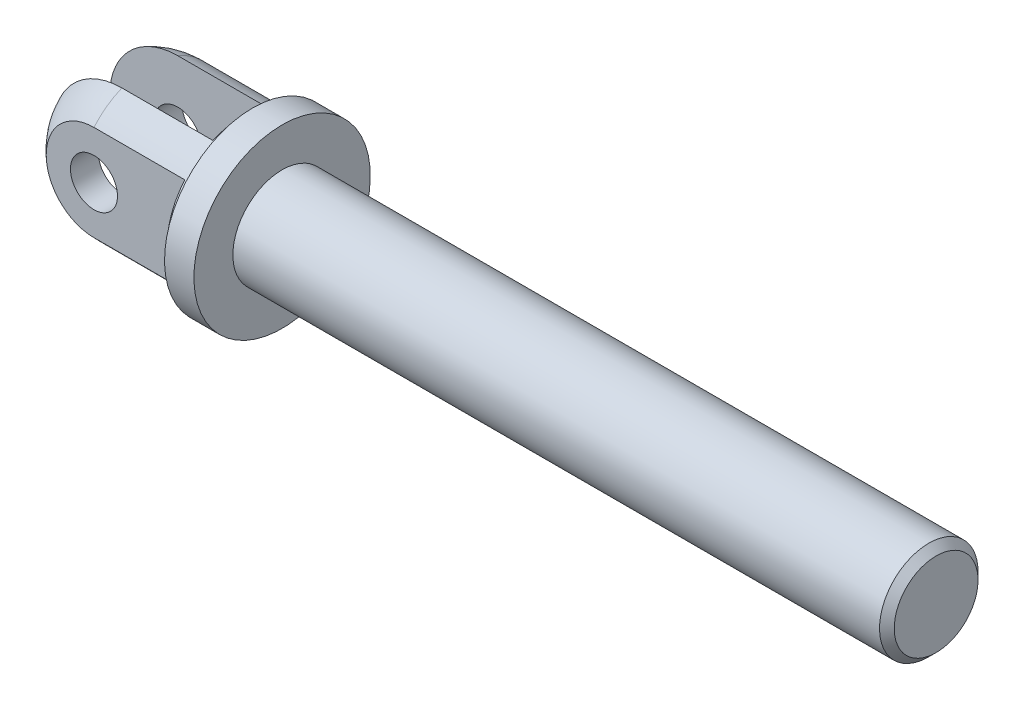
ISO-10303-21;
HEADER;
FILE_DESCRIPTION(('STEP AP214'),'2;1');
FILE_NAME('part.step','',(''),(''),'','','');
FILE_SCHEMA(('AUTOMOTIVE_DESIGN { 1 0 10303 214 1 1 1 1 }'));
ENDSEC;
DATA;
#1=APPLICATION_CONTEXT('core data for automotive mechanical design processes');
#2=APPLICATION_PROTOCOL_DEFINITION('international standard','automotive_design',2000,#1);
#3=PRODUCT_CONTEXT('',#1,'mechanical');
#4=PRODUCT('Part','Part','',(#3));
#5=PRODUCT_RELATED_PRODUCT_CATEGORY('part','',(#4));
#6=PRODUCT_DEFINITION_FORMATION('','',#4);
#7=PRODUCT_DEFINITION_CONTEXT('part definition',#1,'design');
#8=PRODUCT_DEFINITION('design','',#6,#7);
#9=PRODUCT_DEFINITION_SHAPE('','',#8);
#10=(LENGTH_UNIT() NAMED_UNIT(*) SI_UNIT(.MILLI.,.METRE.));
#11=(NAMED_UNIT(*) PLANE_ANGLE_UNIT() SI_UNIT($,.RADIAN.));
#12=(NAMED_UNIT(*) SI_UNIT($,.STERADIAN.) SOLID_ANGLE_UNIT());
#13=UNCERTAINTY_MEASURE_WITH_UNIT(LENGTH_MEASURE(1.E-05),#10,'distance_accuracy_value','');
#14=(GEOMETRIC_REPRESENTATION_CONTEXT(3) GLOBAL_UNCERTAINTY_ASSIGNED_CONTEXT((#13)) GLOBAL_UNIT_ASSIGNED_CONTEXT((#10,
#11,#12)) REPRESENTATION_CONTEXT('',''));
#15=CARTESIAN_POINT('',(0.,0.,0.));
#16=DIRECTION('',(0.,0.,1.));
#17=DIRECTION('',(1.,0.,0.));
#18=AXIS2_PLACEMENT_3D('',#15,#16,#17);
#19=CARTESIAN_POINT('',(6.7,0.,-1.8));
#20=DIRECTION('',(1.,0.,0.));
#21=DIRECTION('',(0.,1.,0.));
#22=AXIS2_PLACEMENT_3D('',#19,#20,#21);
#23=SPHERICAL_SURFACE('',#22,4.99999999999999);
#24=CARTESIAN_POINT('',(6.7,0.,-3.7));
#25=DIRECTION('',(0.,0.,-1.));
#26=DIRECTION('',(-1.,0.,0.));
#27=AXIS2_PLACEMENT_3D('',#24,#25,#26);
#28=CIRCLE('',#27,4.62493243193886);
#29=CARTESIAN_POINT('',(6.7,4.62493243193886,-3.7));
#30=VERTEX_POINT('',#29);
#31=CARTESIAN_POINT('',(6.7,-4.62493243193886,-3.7));
#32=VERTEX_POINT('',#31);
#33=EDGE_CURVE('E171',#30,#32,#28,.F.);
#34=ORIENTED_EDGE('',*,*,#33,.F.);
#35=CARTESIAN_POINT('',(6.7,0.,-1.8));
#36=DIRECTION('',(1.,0.,0.));
#37=DIRECTION('',(0.,1.,0.));
#38=AXIS2_PLACEMENT_3D('',#35,#36,#37);
#39=CIRCLE('',#38,4.99999999999999);
#40=CARTESIAN_POINT('',(6.7,3.24961536185438,-5.59999999999999));
#41=VERTEX_POINT('',#40);
#42=EDGE_CURVE('E146',#41,#30,#39,.T.);
#43=ORIENTED_EDGE('',*,*,#42,.F.);
#44=CARTESIAN_POINT('',(6.7,0.,-5.59999999999999));
#45=DIRECTION('',(0.,0.,1.));
#46=DIRECTION('',(1.,0.,0.));
#47=AXIS2_PLACEMENT_3D('',#44,#45,#46);
#48=CIRCLE('',#47,3.24961536185438);
#49=CARTESIAN_POINT('',(6.7,-3.24961536185438,-5.59999999999999));
#50=VERTEX_POINT('',#49);
#51=EDGE_CURVE('E165',#50,#41,#48,.F.);
#52=ORIENTED_EDGE('',*,*,#51,.F.);
#53=EDGE_CURVE('E57',#32,#50,#39,.T.);
#54=ORIENTED_EDGE('',*,*,#53,.F.);
#55=EDGE_LOOP('',(#34,#43,#52,#54));
#56=FACE_BOUND('',#55,.T.);
#57=ADVANCED_FACE('F33',(#56),#23,.T.);
#58=CARTESIAN_POINT('',(60.2,0.,-1.8));
#59=DIRECTION('',(-1.,0.,0.));
#60=DIRECTION('',(0.,-1.,0.));
#61=AXIS2_PLACEMENT_3D('',#58,#59,#60);
#62=CONICAL_SURFACE('',#61,2.84999999999999,0.785398163397448);
#63=CARTESIAN_POINT('',(59.7,0.,-1.8));
#64=DIRECTION('',(1.,0.,0.));
#65=DIRECTION('',(0.,1.,0.));
#66=AXIS2_PLACEMENT_3D('',#63,#64,#65);
#67=CIRCLE('',#66,3.34999999999999);
#68=CARTESIAN_POINT('',(59.7,3.34999999999999,-1.8));
#69=VERTEX_POINT('',#68);
#70=EDGE_CURVE('E158',#69,#69,#67,.T.);
#71=ORIENTED_EDGE('',*,*,#70,.T.);
#72=EDGE_LOOP('',(#71));
#73=FACE_BOUND('',#72,.T.);
#74=CARTESIAN_POINT('',(60.2,0.,-1.8));
#75=DIRECTION('',(1.,0.,0.));
#76=DIRECTION('',(0.,1.,0.));
#77=AXIS2_PLACEMENT_3D('',#74,#75,#76);
#78=CIRCLE('',#77,2.84999999999999);
#79=CARTESIAN_POINT('',(60.2,2.85,-1.8));
#80=VERTEX_POINT('',#79);
#81=EDGE_CURVE('E140',#80,#80,#78,.T.);
#82=ORIENTED_EDGE('',*,*,#81,.F.);
#83=EDGE_LOOP('',(#82));
#84=FACE_BOUND('',#83,.T.);
#85=ADVANCED_FACE('F35',(#73,#84),#62,.T.);
#86=CARTESIAN_POINT('',(60.2,0.,-1.8));
#87=DIRECTION('',(1.,0.,0.));
#88=DIRECTION('',(0.,1.,0.));
#89=AXIS2_PLACEMENT_3D('',#86,#87,#88);
#90=CYLINDRICAL_SURFACE('',#89,3.34999999999999);
#91=CARTESIAN_POINT('',(15.7,0.,-1.8));
#92=DIRECTION('',(1.,0.,0.));
#93=DIRECTION('',(0.,1.,0.));
#94=AXIS2_PLACEMENT_3D('',#91,#92,#93);
#95=CIRCLE('',#94,3.34999999999999);
#96=CARTESIAN_POINT('',(15.7,3.34999999999999,-1.8));
#97=VERTEX_POINT('',#96);
#98=EDGE_CURVE('E155',#97,#97,#95,.T.);
#99=ORIENTED_EDGE('',*,*,#98,.T.);
#100=EDGE_LOOP('',(#99));
#101=FACE_BOUND('',#100,.T.);
#102=ORIENTED_EDGE('',*,*,#70,.F.);
#103=EDGE_LOOP('',(#102));
#104=FACE_BOUND('',#103,.T.);
#105=ADVANCED_FACE('F207',(#101,#104),#90,.T.);
#106=CARTESIAN_POINT('',(15.7,5.99999999999999,-1.8));
#107=DIRECTION('',(1.,0.,0.));
#108=DIRECTION('',(0.,1.,0.));
#109=AXIS2_PLACEMENT_3D('',#106,#107,#108);
#110=PLANE('',#109);
#111=CARTESIAN_POINT('',(15.7,0.,-1.8));
#112=DIRECTION('',(1.,0.,0.));
#113=DIRECTION('',(0.,1.,0.));
#114=AXIS2_PLACEMENT_3D('',#111,#112,#113);
#115=CIRCLE('',#114,5.99999999999999);
#116=CARTESIAN_POINT('',(15.7,5.99999999999999,-1.8));
#117=VERTEX_POINT('',#116);
#118=EDGE_CURVE('E152',#117,#117,#115,.T.);
#119=ORIENTED_EDGE('',*,*,#118,.T.);
#120=EDGE_LOOP('',(#119));
#121=FACE_BOUND('',#120,.T.);
#122=ORIENTED_EDGE('',*,*,#98,.F.);
#123=EDGE_LOOP('',(#122));
#124=FACE_BOUND('',#123,.T.);
#125=ADVANCED_FACE('F340',(#121,#124),#110,.T.);
#126=CARTESIAN_POINT('',(60.2,0.,-1.8));
#127=DIRECTION('',(1.,0.,0.));
#128=DIRECTION('',(0.,1.,0.));
#129=AXIS2_PLACEMENT_3D('',#126,#127,#128);
#130=CYLINDRICAL_SURFACE('',#129,5.99999999999999);
#131=CARTESIAN_POINT('',(13.7,0.,-1.8));
#132=DIRECTION('',(1.,0.,0.));
#133=DIRECTION('',(0.,1.,0.));
#134=AXIS2_PLACEMENT_3D('',#131,#132,#133);
#135=CIRCLE('',#134,5.99999999999999);
#136=CARTESIAN_POINT('',(13.7,5.99999999999999,-1.8));
#137=VERTEX_POINT('',#136);
#138=EDGE_CURVE('E149',#137,#137,#135,.T.);
#139=ORIENTED_EDGE('',*,*,#138,.T.);
#140=EDGE_LOOP('',(#139));
#141=FACE_BOUND('',#140,.T.);
#142=ORIENTED_EDGE('',*,*,#118,.F.);
#143=EDGE_LOOP('',(#142));
#144=FACE_BOUND('',#143,.T.);
#145=ADVANCED_FACE('F331',(#141,#144),#130,.T.);
#146=CARTESIAN_POINT('',(13.7,4.99999999999999,-1.8));
#147=DIRECTION('',(-1.,0.,0.));
#148=DIRECTION('',(0.,-1.,0.));
#149=AXIS2_PLACEMENT_3D('',#146,#147,#148);
#150=PLANE('',#149);
#151=CARTESIAN_POINT('',(13.7,0.,-1.8));
#152=DIRECTION('',(1.,0.,0.));
#153=DIRECTION('',(0.,1.,0.));
#154=AXIS2_PLACEMENT_3D('',#151,#152,#153);
#155=CIRCLE('',#154,4.99999999999999);
#156=CARTESIAN_POINT('',(13.7,4.99999999999999,-1.8));
#157=VERTEX_POINT('',#156);
#158=EDGE_CURVE('E145',#157,#157,#155,.T.);
#159=ORIENTED_EDGE('',*,*,#158,.T.);
#160=EDGE_LOOP('',(#159));
#161=FACE_BOUND('',#160,.T.);
#162=ORIENTED_EDGE('',*,*,#138,.F.);
#163=EDGE_LOOP('',(#162));
#164=FACE_BOUND('',#163,.T.);
#165=ADVANCED_FACE('F201',(#161,#164),#150,.T.);
#166=CARTESIAN_POINT('',(60.2,0.,-1.8));
#167=DIRECTION('',(1.,0.,0.));
#168=DIRECTION('',(0.,1.,0.));
#169=AXIS2_PLACEMENT_3D('',#166,#167,#168);
#170=CYLINDRICAL_SURFACE('',#169,4.99999999999999);
#171=DIRECTION('',(1.,0.,0.));
#172=VECTOR('',#171,1.);
#173=CARTESIAN_POINT('',(60.2,-4.62493243193886,-3.7));
#174=LINE('',#173,#172);
#175=CARTESIAN_POINT('',(12.877844259685,-4.62493243193886,-3.7));
#176=VERTEX_POINT('',#175);
#177=EDGE_CURVE('E118',#32,#176,#174,.T.);
#178=ORIENTED_EDGE('',*,*,#177,.F.);
#179=ORIENTED_EDGE('',*,*,#53,.T.);
#180=DIRECTION('',(1.,0.,0.));
#181=VECTOR('',#180,1.);
#182=CARTESIAN_POINT('',(60.2,-3.24961536185437,-5.6));
#183=LINE('',#182,#181);
#184=CARTESIAN_POINT('',(12.877844259685,-3.24961536185437,-5.59999999999999));
#185=VERTEX_POINT('',#184);
#186=EDGE_CURVE('E130',#185,#50,#183,.F.);
#187=ORIENTED_EDGE('',*,*,#186,.F.);
#188=CARTESIAN_POINT('',(12.877844259685,0.,-1.8));
#189=DIRECTION('',(1.,0.,0.));
#190=DIRECTION('',(0.,0.,-1.));
#191=AXIS2_PLACEMENT_3D('',#188,#189,#190);
#192=CIRCLE('',#191,4.99999999999999);
#193=CARTESIAN_POINT('',(12.877844259685,3.24961536185437,-5.59999999999999));
#194=VERTEX_POINT('',#193);
#195=EDGE_CURVE('E167',#194,#185,#192,.F.);
#196=ORIENTED_EDGE('',*,*,#195,.F.);
#197=DIRECTION('',(1.,0.,0.));
#198=VECTOR('',#197,1.);
#199=CARTESIAN_POINT('',(60.2,3.24961536185437,-5.6));
#200=LINE('',#199,#198);
#201=EDGE_CURVE('E128',#41,#194,#200,.T.);
#202=ORIENTED_EDGE('',*,*,#201,.F.);
#203=ORIENTED_EDGE('',*,*,#42,.T.);
#204=DIRECTION('',(1.,0.,0.));
#205=VECTOR('',#204,1.);
#206=CARTESIAN_POINT('',(60.2,4.62493243193887,-3.7));
#207=LINE('',#206,#205);
#208=CARTESIAN_POINT('',(12.877844259685,4.62493243193886,-3.7));
#209=VERTEX_POINT('',#208);
#210=EDGE_CURVE('E120',#209,#30,#207,.F.);
#211=ORIENTED_EDGE('',*,*,#210,.F.);
#212=CARTESIAN_POINT('',(12.877844259685,0.,-1.8));
#213=DIRECTION('',(1.,0.,0.));
#214=DIRECTION('',(0.,0.,-1.));
#215=AXIS2_PLACEMENT_3D('',#212,#213,#214);
#216=CIRCLE('',#215,4.99999999999999);
#217=CARTESIAN_POINT('',(12.877844259685,4.62493243193886,0.1));
#218=VERTEX_POINT('',#217);
#219=EDGE_CURVE('E42',#218,#209,#216,.F.);
#220=ORIENTED_EDGE('',*,*,#219,.F.);
#221=DIRECTION('',(1.,0.,0.));
#222=VECTOR('',#221,1.);
#223=CARTESIAN_POINT('',(60.2,4.62493243193887,0.1));
#224=LINE('',#223,#222);
#225=CARTESIAN_POINT('',(6.7,4.62493243193886,0.1));
#226=VERTEX_POINT('',#225);
#227=EDGE_CURVE('E109',#226,#218,#224,.T.);
#228=ORIENTED_EDGE('',*,*,#227,.F.);
#229=CARTESIAN_POINT('',(6.7,3.24961536185438,1.99999999999999));
#230=VERTEX_POINT('',#229);
#231=EDGE_CURVE('E143',#226,#230,#39,.T.);
#232=ORIENTED_EDGE('',*,*,#231,.T.);
#233=DIRECTION('',(1.,0.,0.));
#234=VECTOR('',#233,1.);
#235=CARTESIAN_POINT('',(60.2,3.24961536185438,1.99999999999999));
#236=LINE('',#235,#234);
#237=CARTESIAN_POINT('',(12.877844259685,3.24961536185438,1.99999999999999));
#238=VERTEX_POINT('',#237);
#239=EDGE_CURVE('E137',#238,#230,#236,.F.);
#240=ORIENTED_EDGE('',*,*,#239,.F.);
#241=CARTESIAN_POINT('',(12.877844259685,0.,-1.8));
#242=DIRECTION('',(1.,0.,0.));
#243=DIRECTION('',(0.,0.,-1.));
#244=AXIS2_PLACEMENT_3D('',#241,#242,#243);
#245=CIRCLE('',#244,4.99999999999999);
#246=CARTESIAN_POINT('',(12.877844259685,-3.24961536185438,1.99999999999999));
#247=VERTEX_POINT('',#246);
#248=EDGE_CURVE('E163',#247,#238,#245,.F.);
#249=ORIENTED_EDGE('',*,*,#248,.F.);
#250=DIRECTION('',(1.,0.,0.));
#251=VECTOR('',#250,1.);
#252=CARTESIAN_POINT('',(60.2,-3.24961536185438,1.99999999999999));
#253=LINE('',#252,#251);
#254=CARTESIAN_POINT('',(6.7,-3.24961536185438,1.99999999999999));
#255=VERTEX_POINT('',#254);
#256=EDGE_CURVE('E135',#255,#247,#253,.T.);
#257=ORIENTED_EDGE('',*,*,#256,.F.);
#258=CARTESIAN_POINT('',(6.7,-4.62493243193886,0.1));
#259=VERTEX_POINT('',#258);
#260=EDGE_CURVE('E117',#255,#259,#39,.T.);
#261=ORIENTED_EDGE('',*,*,#260,.T.);
#262=DIRECTION('',(1.,0.,0.));
#263=VECTOR('',#262,1.);
#264=CARTESIAN_POINT('',(60.2,-4.62493243193886,0.1));
#265=LINE('',#264,#263);
#266=CARTESIAN_POINT('',(12.877844259685,-4.62493243193886,0.1));
#267=VERTEX_POINT('',#266);
#268=EDGE_CURVE('E49',#267,#259,#265,.F.);
#269=ORIENTED_EDGE('',*,*,#268,.F.);
#270=EDGE_CURVE('E11',#176,#267,#216,.F.);
#271=ORIENTED_EDGE('',*,*,#270,.F.);
#272=EDGE_LOOP('',(#178,#179,#187,#196,#202,#203,#211,#220,#228,#232,#240,#249,#257,#261,#269,#271));
#273=FACE_BOUND('',#272,.T.);
#274=ORIENTED_EDGE('',*,*,#158,.F.);
#275=EDGE_LOOP('',(#274));
#276=FACE_BOUND('',#275,.T.);
#277=ADVANCED_FACE('F113',(#273,#276),#170,.T.);
#278=CARTESIAN_POINT('',(6.7,0.,0.1));
#279=DIRECTION('',(0.,0.,1.));
#280=DIRECTION('',(1.,0.,0.));
#281=AXIS2_PLACEMENT_3D('',#278,#279,#280);
#282=CIRCLE('',#281,4.62493243193886);
#283=EDGE_CURVE('E169',#259,#226,#282,.F.);
#284=ORIENTED_EDGE('',*,*,#283,.F.);
#285=ORIENTED_EDGE('',*,*,#260,.F.);
#286=CARTESIAN_POINT('',(6.7,0.,1.99999999999999));
#287=DIRECTION('',(0.,0.,-1.));
#288=DIRECTION('',(-1.,0.,0.));
#289=AXIS2_PLACEMENT_3D('',#286,#287,#288);
#290=CIRCLE('',#289,3.24961536185438);
#291=EDGE_CURVE('E161',#230,#255,#290,.F.);
#292=ORIENTED_EDGE('',*,*,#291,.F.);
#293=ORIENTED_EDGE('',*,*,#231,.F.);
#294=EDGE_LOOP('',(#284,#285,#292,#293));
#295=FACE_BOUND('',#294,.T.);
#296=ADVANCED_FACE('F191',(#295),#23,.T.);
#297=CARTESIAN_POINT('',(60.2,2.85,-1.8));
#298=DIRECTION('',(1.,0.,0.));
#299=DIRECTION('',(0.,1.,0.));
#300=AXIS2_PLACEMENT_3D('',#297,#298,#299);
#301=PLANE('',#300);
#302=ORIENTED_EDGE('',*,*,#81,.T.);
#303=EDGE_LOOP('',(#302));
#304=FACE_BOUND('',#303,.T.);
#305=ADVANCED_FACE('F193',(#304),#301,.T.);
#306=CARTESIAN_POINT('',(2.61680338606674,-50.,1.99999999999999));
#307=DIRECTION('',(0.,0.,-1.));
#308=DIRECTION('',(-1.,0.,0.));
#309=AXIS2_PLACEMENT_3D('',#306,#307,#308);
#310=PLANE('',#309);
#311=CARTESIAN_POINT('',(6.7,0.,1.99999999999999));
#312=DIRECTION('',(0.,0.,1.));
#313=DIRECTION('',(1.,0.,0.));
#314=AXIS2_PLACEMENT_3D('',#311,#312,#313);
#315=CIRCLE('',#314,1.6);
#316=CARTESIAN_POINT('',(8.3,0.,1.99999999999999));
#317=VERTEX_POINT('',#316);
#318=EDGE_CURVE('E234',#317,#317,#315,.T.);
#319=ORIENTED_EDGE('',*,*,#318,.F.);
#320=EDGE_LOOP('',(#319));
#321=FACE_BOUND('',#320,.T.);
#322=ORIENTED_EDGE('',*,*,#239,.T.);
#323=ORIENTED_EDGE('',*,*,#291,.T.);
#324=ORIENTED_EDGE('',*,*,#256,.T.);
#325=DIRECTION('',(0.,1.,0.));
#326=VECTOR('',#325,1.);
#327=CARTESIAN_POINT('',(12.877844259685,-50.,1.99999999999999));
#328=LINE('',#327,#326);
#329=EDGE_CURVE('E132',#247,#238,#328,.T.);
#330=ORIENTED_EDGE('',*,*,#329,.T.);
#331=EDGE_LOOP('',(#322,#323,#324,#330));
#332=FACE_BOUND('',#331,.T.);
#333=ADVANCED_FACE('F189',(#321,#332),#310,.F.);
#334=CARTESIAN_POINT('',(12.877844259685,-50.,3.40481946602665));
#335=DIRECTION('',(1.,0.,0.));
#336=DIRECTION('',(0.,0.,-1.));
#337=AXIS2_PLACEMENT_3D('',#334,#335,#336);
#338=PLANE('',#337);
#339=ORIENTED_EDGE('',*,*,#248,.T.);
#340=ORIENTED_EDGE('',*,*,#329,.F.);
#341=EDGE_LOOP('',(#339,#340));
#342=FACE_BOUND('',#341,.T.);
#343=ADVANCED_FACE('F215',(#342),#338,.F.);
#344=CARTESIAN_POINT('',(12.877844259685,-50.,-7.00481946602665));
#345=DIRECTION('',(1.,0.,0.));
#346=DIRECTION('',(0.,0.,-1.));
#347=AXIS2_PLACEMENT_3D('',#344,#345,#346);
#348=PLANE('',#347);
#349=ORIENTED_EDGE('',*,*,#195,.T.);
#350=DIRECTION('',(0.,1.,0.));
#351=VECTOR('',#350,1.);
#352=CARTESIAN_POINT('',(12.877844259685,-50.,-5.59999999999999));
#353=LINE('',#352,#351);
#354=EDGE_CURVE('E125',#185,#194,#353,.T.);
#355=ORIENTED_EDGE('',*,*,#354,.T.);
#356=EDGE_LOOP('',(#349,#355));
#357=FACE_BOUND('',#356,.T.);
#358=ADVANCED_FACE('F213',(#357),#348,.F.);
#359=CARTESIAN_POINT('',(2.61680338606673,-50.,-5.59999999999999));
#360=DIRECTION('',(0.,0.,1.));
#361=DIRECTION('',(1.,0.,0.));
#362=AXIS2_PLACEMENT_3D('',#359,#360,#361);
#363=PLANE('',#362);
#364=CARTESIAN_POINT('',(6.7,0.,-5.59999999999999));
#365=DIRECTION('',(0.,0.,1.));
#366=DIRECTION('',(1.,0.,0.));
#367=AXIS2_PLACEMENT_3D('',#364,#365,#366);
#368=CIRCLE('',#367,1.6);
#369=CARTESIAN_POINT('',(8.3,0.,-5.59999999999999));
#370=VERTEX_POINT('',#369);
#371=EDGE_CURVE('E110',#370,#370,#368,.T.);
#372=ORIENTED_EDGE('',*,*,#371,.T.);
#373=EDGE_LOOP('',(#372));
#374=FACE_BOUND('',#373,.T.);
#375=ORIENTED_EDGE('',*,*,#186,.T.);
#376=ORIENTED_EDGE('',*,*,#51,.T.);
#377=ORIENTED_EDGE('',*,*,#201,.T.);
#378=ORIENTED_EDGE('',*,*,#354,.F.);
#379=EDGE_LOOP('',(#375,#376,#377,#378));
#380=FACE_BOUND('',#379,.T.);
#381=ADVANCED_FACE('F210',(#374,#380),#363,.F.);
#382=CARTESIAN_POINT('',(1.67128395327063,-50.,-3.7));
#383=DIRECTION('',(0.,0.,-1.));
#384=DIRECTION('',(-1.,0.,0.));
#385=AXIS2_PLACEMENT_3D('',#382,#383,#384);
#386=PLANE('',#385);
#387=CARTESIAN_POINT('',(6.7,0.,-3.7));
#388=DIRECTION('',(0.,0.,-1.));
#389=DIRECTION('',(-1.,0.,0.));
#390=AXIS2_PLACEMENT_3D('',#387,#388,#389);
#391=CIRCLE('',#390,1.6);
#392=CARTESIAN_POINT('',(5.1,0.,-3.7));
#393=VERTEX_POINT('',#392);
#394=EDGE_CURVE('E238',#393,#393,#391,.T.);
#395=ORIENTED_EDGE('',*,*,#394,.T.);
#396=EDGE_LOOP('',(#395));
#397=FACE_BOUND('',#396,.T.);
#398=ORIENTED_EDGE('',*,*,#210,.T.);
#399=ORIENTED_EDGE('',*,*,#33,.T.);
#400=ORIENTED_EDGE('',*,*,#177,.T.);
#401=DIRECTION('',(0.,1.,0.));
#402=VECTOR('',#401,1.);
#403=CARTESIAN_POINT('',(12.877844259685,-50.,-3.7));
#404=LINE('',#403,#402);
#405=EDGE_CURVE('E106',#176,#209,#404,.T.);
#406=ORIENTED_EDGE('',*,*,#405,.T.);
#407=EDGE_LOOP('',(#398,#399,#400,#406));
#408=FACE_BOUND('',#407,.T.);
#409=ADVANCED_FACE('F174',(#397,#408),#386,.F.);
#410=CARTESIAN_POINT('',(12.877844259685,-50.,-3.7));
#411=DIRECTION('',(1.,0.,0.));
#412=DIRECTION('',(0.,0.,-1.));
#413=AXIS2_PLACEMENT_3D('',#410,#411,#412);
#414=PLANE('',#413);
#415=ORIENTED_EDGE('',*,*,#270,.T.);
#416=DIRECTION('',(0.,1.,0.));
#417=VECTOR('',#416,1.);
#418=CARTESIAN_POINT('',(12.877844259685,-50.,0.1));
#419=LINE('',#418,#417);
#420=EDGE_CURVE('E103',#267,#218,#419,.T.);
#421=ORIENTED_EDGE('',*,*,#420,.T.);
#422=ORIENTED_EDGE('',*,*,#219,.T.);
#423=ORIENTED_EDGE('',*,*,#405,.F.);
#424=EDGE_LOOP('',(#415,#421,#422,#423));
#425=FACE_BOUND('',#424,.T.);
#426=ADVANCED_FACE('F102',(#425),#414,.F.);
#427=CARTESIAN_POINT('',(1.67128395327063,-50.,0.1));
#428=DIRECTION('',(0.,0.,1.));
#429=DIRECTION('',(1.,0.,0.));
#430=AXIS2_PLACEMENT_3D('',#427,#428,#429);
#431=PLANE('',#430);
#432=CARTESIAN_POINT('',(6.7,0.,0.0999999999999994));
#433=DIRECTION('',(0.,0.,1.));
#434=DIRECTION('',(1.,0.,0.));
#435=AXIS2_PLACEMENT_3D('',#432,#433,#434);
#436=CIRCLE('',#435,1.6);
#437=CARTESIAN_POINT('',(8.3,0.,0.0999999999999994));
#438=VERTEX_POINT('',#437);
#439=EDGE_CURVE('E37',#438,#438,#436,.T.);
#440=ORIENTED_EDGE('',*,*,#439,.T.);
#441=EDGE_LOOP('',(#440));
#442=FACE_BOUND('',#441,.T.);
#443=ORIENTED_EDGE('',*,*,#268,.T.);
#444=ORIENTED_EDGE('',*,*,#283,.T.);
#445=ORIENTED_EDGE('',*,*,#227,.T.);
#446=ORIENTED_EDGE('',*,*,#420,.F.);
#447=EDGE_LOOP('',(#443,#444,#445,#446));
#448=FACE_BOUND('',#447,.T.);
#449=ADVANCED_FACE('F107',(#442,#448),#431,.F.);
#450=CARTESIAN_POINT('',(6.7,0.,-7.79999999999999));
#451=DIRECTION('',(0.,0.,1.));
#452=DIRECTION('',(1.,0.,0.));
#453=AXIS2_PLACEMENT_3D('',#450,#451,#452);
#454=CYLINDRICAL_SURFACE('',#453,1.6);
#455=ORIENTED_EDGE('',*,*,#318,.T.);
#456=EDGE_LOOP('',(#455));
#457=FACE_BOUND('',#456,.T.);
#458=ORIENTED_EDGE('',*,*,#439,.F.);
#459=EDGE_LOOP('',(#458));
#460=FACE_BOUND('',#459,.T.);
#461=ADVANCED_FACE('F247',(#457,#460),#454,.F.);
#462=ORIENTED_EDGE('',*,*,#394,.F.);
#463=EDGE_LOOP('',(#462));
#464=FACE_BOUND('',#463,.T.);
#465=ORIENTED_EDGE('',*,*,#371,.F.);
#466=EDGE_LOOP('',(#465));
#467=FACE_BOUND('',#466,.T.);
#468=ADVANCED_FACE('F245',(#464,#467),#454,.F.);
#469=CLOSED_SHELL('',(#57,#85,#105,#125,#145,#165,#277,#296,#305,#333,#343,#358,#381,#409,#426,
#449,#461,#468));
#470=MANIFOLD_SOLID_BREP('B2',#469);
#471=ADVANCED_BREP_SHAPE_REPRESENTATION('',(#18,#470),#14);
#472=SHAPE_DEFINITION_REPRESENTATION(#9,#471);
ENDSEC;
END-ISO-10303-21;
